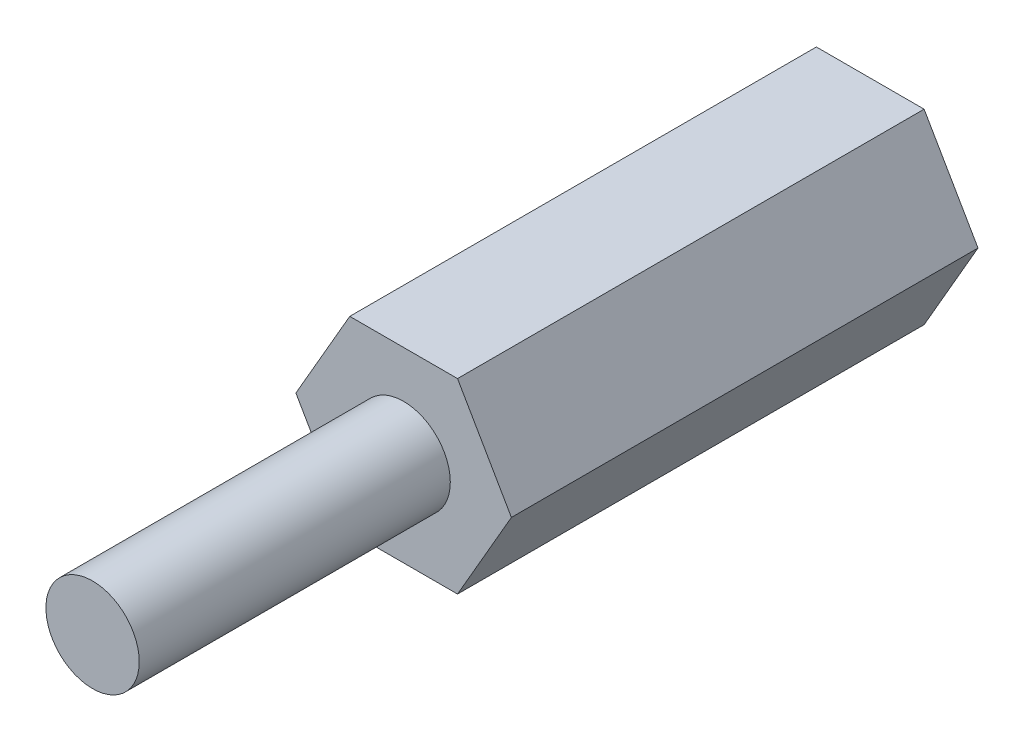
ISO-10303-21;
HEADER;
FILE_DESCRIPTION(('STEP AP214'),'2;1');
FILE_NAME('part.step','',(''),(''),'','','');
FILE_SCHEMA(('AUTOMOTIVE_DESIGN { 1 0 10303 214 1 1 1 1 }'));
ENDSEC;
DATA;
#1=APPLICATION_CONTEXT('core data for automotive mechanical design processes');
#2=APPLICATION_PROTOCOL_DEFINITION('international standard','automotive_design',2000,#1);
#3=PRODUCT_CONTEXT('',#1,'mechanical');
#4=PRODUCT('Part','Part','',(#3));
#5=PRODUCT_RELATED_PRODUCT_CATEGORY('part','',(#4));
#6=PRODUCT_DEFINITION_FORMATION('','',#4);
#7=PRODUCT_DEFINITION_CONTEXT('part definition',#1,'design');
#8=PRODUCT_DEFINITION('design','',#6,#7);
#9=PRODUCT_DEFINITION_SHAPE('','',#8);
#10=(LENGTH_UNIT() NAMED_UNIT(*) SI_UNIT(.MILLI.,.METRE.));
#11=(NAMED_UNIT(*) PLANE_ANGLE_UNIT() SI_UNIT($,.RADIAN.));
#12=(NAMED_UNIT(*) SI_UNIT($,.STERADIAN.) SOLID_ANGLE_UNIT());
#13=UNCERTAINTY_MEASURE_WITH_UNIT(LENGTH_MEASURE(1.E-05),#10,'distance_accuracy_value','');
#14=(GEOMETRIC_REPRESENTATION_CONTEXT(3) GLOBAL_UNCERTAINTY_ASSIGNED_CONTEXT((#13)) GLOBAL_UNIT_ASSIGNED_CONTEXT((#10,
#11,#12)) REPRESENTATION_CONTEXT('',''));
#15=CARTESIAN_POINT('',(0.,0.,0.));
#16=DIRECTION('',(0.,0.,1.));
#17=DIRECTION('',(1.,0.,0.));
#18=AXIS2_PLACEMENT_3D('',#15,#16,#17);
#19=CARTESIAN_POINT('',(0.,635.832012286218,-333.357743681072));
#20=DIRECTION('',(0.,0.,1.));
#21=DIRECTION('',(1.,0.,0.));
#22=AXIS2_PLACEMENT_3D('',#19,#20,#21);
#23=PLANE('',#22);
#24=CARTESIAN_POINT('',(0.,635.832012286218,-333.357743681072));
#25=DIRECTION('',(0.,0.,1.));
#26=DIRECTION('',(1.,0.,0.));
#27=AXIS2_PLACEMENT_3D('',#24,#25,#26);
#28=CIRCLE('',#27,1.5);
#29=CARTESIAN_POINT('',(1.5,635.832012286218,-333.357743681072));
#30=VERTEX_POINT('',#29);
#31=EDGE_CURVE('E20',#30,#30,#28,.F.);
#32=ORIENTED_EDGE('',*,*,#31,.F.);
#33=EDGE_LOOP('',(#32));
#34=FACE_BOUND('',#33,.T.);
#35=ADVANCED_FACE('F17',(#34),#23,.T.);
#36=CARTESIAN_POINT('',(0.,635.832012286218,-348.357743681072));
#37=DIRECTION('',(0.,0.,1.));
#38=DIRECTION('',(1.,0.,0.));
#39=AXIS2_PLACEMENT_3D('',#36,#37,#38);
#40=PLANE('',#39);
#41=CARTESIAN_POINT('',(0.,635.832012286218,-348.357743681072));
#42=DIRECTION('',(0.,0.,1.));
#43=DIRECTION('',(1.,0.,0.));
#44=AXIS2_PLACEMENT_3D('',#41,#42,#43);
#45=CIRCLE('',#44,1.25);
#46=CARTESIAN_POINT('',(1.25,635.832012286218,-348.357743681072));
#47=VERTEX_POINT('',#46);
#48=EDGE_CURVE('E80',#47,#47,#45,.F.);
#49=ORIENTED_EDGE('',*,*,#48,.T.);
#50=EDGE_LOOP('',(#49));
#51=FACE_BOUND('',#50,.T.);
#52=ADVANCED_FACE('F105',(#51),#40,.F.);
#53=CARTESIAN_POINT('',(0.,635.832012286218,-338.357743681072));
#54=DIRECTION('',(0.,0.,1.));
#55=DIRECTION('',(1.,0.,0.));
#56=AXIS2_PLACEMENT_3D('',#53,#54,#55);
#57=CYLINDRICAL_SURFACE('',#56,1.5);
#58=CARTESIAN_POINT('',(0.,635.832012286218,-343.357743681072));
#59=DIRECTION('',(0.,0.,1.));
#60=DIRECTION('',(1.,0.,0.));
#61=AXIS2_PLACEMENT_3D('',#58,#59,#60);
#62=CIRCLE('',#61,1.5);
#63=CARTESIAN_POINT('',(1.5,635.832012286218,-343.357743681072));
#64=VERTEX_POINT('',#63);
#65=EDGE_CURVE('E99',#64,#64,#62,.F.);
#66=ORIENTED_EDGE('',*,*,#65,.F.);
#67=EDGE_LOOP('',(#66));
#68=FACE_BOUND('',#67,.T.);
#69=ORIENTED_EDGE('',*,*,#31,.T.);
#70=EDGE_LOOP('',(#69));
#71=FACE_BOUND('',#70,.T.);
#72=ADVANCED_FACE('F168',(#68,#71),#57,.T.);
#73=CARTESIAN_POINT('',(1.73205080756861,638.832012286218,-358.357743681072));
#74=DIRECTION('',(0.866025403784443,0.499999999999992,0.));
#75=DIRECTION('',(-0.499999999999992,0.866025403784443,0.));
#76=AXIS2_PLACEMENT_3D('',#73,#74,#75);
#77=PLANE('',#76);
#78=DIRECTION('',(-0.500000000000041,0.866025403784415,0.));
#79=VECTOR('',#78,1.);
#80=CARTESIAN_POINT('',(3.46410161513768,635.832012286218,-358.357743681072));
#81=LINE('',#80,#79);
#82=CARTESIAN_POINT('',(3.4641016151376,635.832012286218,-358.357743681072));
#83=VERTEX_POINT('',#82);
#84=CARTESIAN_POINT('',(1.73205080756861,638.832012286218,-358.357743681072));
#85=VERTEX_POINT('',#84);
#86=EDGE_CURVE('E154',#83,#85,#81,.T.);
#87=ORIENTED_EDGE('',*,*,#86,.T.);
#88=DIRECTION('',(0.,0.,1.));
#89=VECTOR('',#88,1.);
#90=CARTESIAN_POINT('',(1.73205080756861,638.832012286218,-358.357743681072));
#91=LINE('',#90,#89);
#92=CARTESIAN_POINT('',(1.73205080756861,638.832012286218,-343.357743681072));
#93=VERTEX_POINT('',#92);
#94=EDGE_CURVE('E67',#93,#85,#91,.F.);
#95=ORIENTED_EDGE('',*,*,#94,.F.);
#96=DIRECTION('',(-0.500000000000041,0.866025403784415,0.));
#97=VECTOR('',#96,1.);
#98=CARTESIAN_POINT('',(3.46410161513768,635.832012286218,-343.357743681072));
#99=LINE('',#98,#97);
#100=CARTESIAN_POINT('',(3.46410161513764,635.832012286218,-343.357743681072));
#101=VERTEX_POINT('',#100);
#102=EDGE_CURVE('E83',#101,#93,#99,.T.);
#103=ORIENTED_EDGE('',*,*,#102,.F.);
#104=DIRECTION('',(0.,0.,1.));
#105=VECTOR('',#104,1.);
#106=CARTESIAN_POINT('',(3.46410161513768,635.832012286218,-358.357743681072));
#107=LINE('',#106,#105);
#108=EDGE_CURVE('E72',#83,#101,#107,.T.);
#109=ORIENTED_EDGE('',*,*,#108,.F.);
#110=EDGE_LOOP('',(#87,#95,#103,#109));
#111=FACE_BOUND('',#110,.T.);
#112=ADVANCED_FACE('F84',(#111),#77,.T.);
#113=CARTESIAN_POINT('',(-1.73205080756861,638.832012286218,-358.357743681072));
#114=DIRECTION('',(0.,1.,0.));
#115=DIRECTION('',(0.,0.,1.));
#116=AXIS2_PLACEMENT_3D('',#113,#114,#115);
#117=PLANE('',#116);
#118=DIRECTION('',(1.,0.,0.));
#119=VECTOR('',#118,1.);
#120=CARTESIAN_POINT('',(0.,638.832012286218,-358.357743681072));
#121=LINE('',#120,#119);
#122=CARTESIAN_POINT('',(-1.73205080756865,638.832012286218,-358.357743681072));
#123=VERTEX_POINT('',#122);
#124=EDGE_CURVE('E152',#85,#123,#121,.F.);
#125=ORIENTED_EDGE('',*,*,#124,.T.);
#126=DIRECTION('',(0.,0.,1.));
#127=VECTOR('',#126,1.);
#128=CARTESIAN_POINT('',(-1.73205080756878,638.832012286218,-358.357743681072));
#129=LINE('',#128,#127);
#130=CARTESIAN_POINT('',(-1.73205080756865,638.832012286218,-343.357743681072));
#131=VERTEX_POINT('',#130);
#132=EDGE_CURVE('E156',#131,#123,#129,.F.);
#133=ORIENTED_EDGE('',*,*,#132,.F.);
#134=DIRECTION('',(1.,0.,0.));
#135=VECTOR('',#134,1.);
#136=CARTESIAN_POINT('',(0.,638.832012286218,-343.357743681072));
#137=LINE('',#136,#135);
#138=EDGE_CURVE('E86',#93,#131,#137,.F.);
#139=ORIENTED_EDGE('',*,*,#138,.F.);
#140=ORIENTED_EDGE('',*,*,#94,.T.);
#141=EDGE_LOOP('',(#125,#133,#139,#140));
#142=FACE_BOUND('',#141,.T.);
#143=ADVANCED_FACE('F110',(#142),#117,.T.);
#144=CARTESIAN_POINT('',(0.,635.832012286218,-353.357743681072));
#145=DIRECTION('',(0.,0.,1.));
#146=DIRECTION('',(1.,0.,0.));
#147=AXIS2_PLACEMENT_3D('',#144,#145,#146);
#148=CYLINDRICAL_SURFACE('',#147,1.25);
#149=ORIENTED_EDGE('',*,*,#48,.F.);
#150=EDGE_LOOP('',(#149));
#151=FACE_BOUND('',#150,.T.);
#152=CARTESIAN_POINT('',(0.,635.832012286218,-358.357743681072));
#153=DIRECTION('',(0.,0.,1.));
#154=DIRECTION('',(1.,0.,0.));
#155=AXIS2_PLACEMENT_3D('',#152,#153,#154);
#156=CIRCLE('',#155,1.25);
#157=CARTESIAN_POINT('',(1.25,635.832012286218,-358.357743681072));
#158=VERTEX_POINT('',#157);
#159=EDGE_CURVE('E96',#158,#158,#156,.F.);
#160=ORIENTED_EDGE('',*,*,#159,.T.);
#161=EDGE_LOOP('',(#160));
#162=FACE_BOUND('',#161,.T.);
#163=ADVANCED_FACE('F107',(#151,#162),#148,.F.);
#164=CARTESIAN_POINT('',(3.46410161513768,635.832012286218,-358.357743681072));
#165=DIRECTION('',(0.866025403784443,-0.499999999999992,0.));
#166=DIRECTION('',(0.499999999999992,0.866025403784443,0.));
#167=AXIS2_PLACEMENT_3D('',#164,#165,#166);
#168=PLANE('',#167);
#169=DIRECTION('',(0.500000000000041,0.866025403784415,0.));
#170=VECTOR('',#169,1.);
#171=CARTESIAN_POINT('',(1.73205080756861,632.832012286218,-358.357743681072));
#172=LINE('',#171,#170);
#173=CARTESIAN_POINT('',(1.73205080756865,632.832012286218,-358.357743681072));
#174=VERTEX_POINT('',#173);
#175=EDGE_CURVE('E78',#174,#83,#172,.T.);
#176=ORIENTED_EDGE('',*,*,#175,.T.);
#177=ORIENTED_EDGE('',*,*,#108,.T.);
#178=DIRECTION('',(0.500000000000041,0.866025403784415,0.));
#179=VECTOR('',#178,1.);
#180=CARTESIAN_POINT('',(1.73205080756861,632.832012286218,-343.357743681072));
#181=LINE('',#180,#179);
#182=CARTESIAN_POINT('',(1.73205080756865,632.832012286218,-343.357743681072));
#183=VERTEX_POINT('',#182);
#184=EDGE_CURVE('E76',#183,#101,#181,.T.);
#185=ORIENTED_EDGE('',*,*,#184,.F.);
#186=DIRECTION('',(0.,0.,-1.));
#187=VECTOR('',#186,1.);
#188=CARTESIAN_POINT('',(1.73205080756861,632.832012286218,-358.357743681072));
#189=LINE('',#188,#187);
#190=EDGE_CURVE('E145',#174,#183,#189,.F.);
#191=ORIENTED_EDGE('',*,*,#190,.F.);
#192=EDGE_LOOP('',(#176,#177,#185,#191));
#193=FACE_BOUND('',#192,.T.);
#194=ADVANCED_FACE('F73',(#193),#168,.T.);
#195=CARTESIAN_POINT('',(0.,635.832012286218,-343.357743681072));
#196=DIRECTION('',(0.,0.,1.));
#197=DIRECTION('',(1.,0.,0.));
#198=AXIS2_PLACEMENT_3D('',#195,#196,#197);
#199=PLANE('',#198);
#200=ORIENTED_EDGE('',*,*,#65,.T.);
#201=EDGE_LOOP('',(#200));
#202=FACE_BOUND('',#201,.T.);
#203=DIRECTION('',(-0.499999999999992,-0.866025403784443,0.));
#204=VECTOR('',#203,1.);
#205=CARTESIAN_POINT('',(-3.46410161513768,635.832012286218,-343.357743681072));
#206=LINE('',#205,#204);
#207=CARTESIAN_POINT('',(-3.46410161513764,635.832012286218,-343.357743681072));
#208=VERTEX_POINT('',#207);
#209=EDGE_CURVE('E101',#208,#131,#206,.F.);
#210=ORIENTED_EDGE('',*,*,#209,.F.);
#211=DIRECTION('',(0.499999999999992,-0.866025403784443,0.));
#212=VECTOR('',#211,1.);
#213=CARTESIAN_POINT('',(-1.73205080756861,632.832012286218,-343.357743681072));
#214=LINE('',#213,#212);
#215=CARTESIAN_POINT('',(-1.73205080756861,632.832012286218,-343.357743681072));
#216=VERTEX_POINT('',#215);
#217=EDGE_CURVE('E141',#216,#208,#214,.F.);
#218=ORIENTED_EDGE('',*,*,#217,.F.);
#219=DIRECTION('',(1.,0.,0.));
#220=VECTOR('',#219,1.);
#221=CARTESIAN_POINT('',(1.73205080756861,632.832012286218,-343.357743681072));
#222=LINE('',#221,#220);
#223=EDGE_CURVE('E90',#183,#216,#222,.F.);
#224=ORIENTED_EDGE('',*,*,#223,.F.);
#225=ORIENTED_EDGE('',*,*,#184,.T.);
#226=ORIENTED_EDGE('',*,*,#102,.T.);
#227=ORIENTED_EDGE('',*,*,#138,.T.);
#228=EDGE_LOOP('',(#210,#218,#224,#225,#226,#227));
#229=FACE_BOUND('',#228,.T.);
#230=ADVANCED_FACE('F88',(#202,#229),#199,.T.);
#231=CARTESIAN_POINT('',(-3.46410161513768,635.832012286218,-358.357743681072));
#232=DIRECTION('',(-0.866025403784443,0.499999999999992,0.));
#233=DIRECTION('',(-0.499999999999992,-0.866025403784443,0.));
#234=AXIS2_PLACEMENT_3D('',#231,#232,#233);
#235=PLANE('',#234);
#236=DIRECTION('',(-0.500000000000041,-0.866025403784415,0.));
#237=VECTOR('',#236,1.);
#238=CARTESIAN_POINT('',(-1.73205080756861,638.832012286218,-358.357743681072));
#239=LINE('',#238,#237);
#240=CARTESIAN_POINT('',(-3.46410161513764,635.832012286218,-358.357743681072));
#241=VERTEX_POINT('',#240);
#242=EDGE_CURVE('E150',#123,#241,#239,.T.);
#243=ORIENTED_EDGE('',*,*,#242,.T.);
#244=DIRECTION('',(0.,0.,1.));
#245=VECTOR('',#244,1.);
#246=CARTESIAN_POINT('',(-3.46410161513751,635.832012286218,-358.357743681072));
#247=LINE('',#246,#245);
#248=EDGE_CURVE('E138',#208,#241,#247,.F.);
#249=ORIENTED_EDGE('',*,*,#248,.F.);
#250=ORIENTED_EDGE('',*,*,#209,.T.);
#251=ORIENTED_EDGE('',*,*,#132,.T.);
#252=EDGE_LOOP('',(#243,#249,#250,#251));
#253=FACE_BOUND('',#252,.T.);
#254=ADVANCED_FACE('F117',(#253),#235,.T.);
#255=CARTESIAN_POINT('',(0.,635.832012286218,-358.357743681072));
#256=DIRECTION('',(0.,0.,1.));
#257=DIRECTION('',(1.,0.,0.));
#258=AXIS2_PLACEMENT_3D('',#255,#256,#257);
#259=PLANE('',#258);
#260=ORIENTED_EDGE('',*,*,#159,.F.);
#261=EDGE_LOOP('',(#260));
#262=FACE_BOUND('',#261,.T.);
#263=DIRECTION('',(1.,0.,0.));
#264=VECTOR('',#263,1.);
#265=CARTESIAN_POINT('',(1.73205080756861,632.832012286218,-358.357743681072));
#266=LINE('',#265,#264);
#267=CARTESIAN_POINT('',(-1.73205080756861,632.832012286218,-358.357743681072));
#268=VERTEX_POINT('',#267);
#269=EDGE_CURVE('E35',#268,#174,#266,.T.);
#270=ORIENTED_EDGE('',*,*,#269,.F.);
#271=DIRECTION('',(0.499999999999992,-0.866025403784443,0.));
#272=VECTOR('',#271,1.);
#273=CARTESIAN_POINT('',(-1.73205080756861,632.832012286218,-358.357743681072));
#274=LINE('',#273,#272);
#275=EDGE_CURVE('E26',#241,#268,#274,.T.);
#276=ORIENTED_EDGE('',*,*,#275,.F.);
#277=ORIENTED_EDGE('',*,*,#242,.F.);
#278=ORIENTED_EDGE('',*,*,#124,.F.);
#279=ORIENTED_EDGE('',*,*,#86,.F.);
#280=ORIENTED_EDGE('',*,*,#175,.F.);
#281=EDGE_LOOP('',(#270,#276,#277,#278,#279,#280));
#282=FACE_BOUND('',#281,.T.);
#283=ADVANCED_FACE('F114',(#262,#282),#259,.F.);
#284=CARTESIAN_POINT('',(1.73205080756861,632.832012286218,-358.357743681072));
#285=DIRECTION('',(0.,-1.,0.));
#286=DIRECTION('',(0.,0.,-1.));
#287=AXIS2_PLACEMENT_3D('',#284,#285,#286);
#288=PLANE('',#287);
#289=ORIENTED_EDGE('',*,*,#269,.T.);
#290=ORIENTED_EDGE('',*,*,#190,.T.);
#291=ORIENTED_EDGE('',*,*,#223,.T.);
#292=DIRECTION('',(0.,0.,1.));
#293=VECTOR('',#292,1.);
#294=CARTESIAN_POINT('',(-1.73205080756861,632.832012286218,-358.357743681072));
#295=LINE('',#294,#293);
#296=EDGE_CURVE('E11',#268,#216,#295,.T.);
#297=ORIENTED_EDGE('',*,*,#296,.F.);
#298=EDGE_LOOP('',(#289,#290,#291,#297));
#299=FACE_BOUND('',#298,.T.);
#300=ADVANCED_FACE('F116',(#299),#288,.T.);
#301=CARTESIAN_POINT('',(-1.73205080756861,632.832012286218,-358.357743681072));
#302=DIRECTION('',(-0.866025403784443,-0.499999999999992,0.));
#303=DIRECTION('',(0.499999999999992,-0.866025403784443,0.));
#304=AXIS2_PLACEMENT_3D('',#301,#302,#303);
#305=PLANE('',#304);
#306=ORIENTED_EDGE('',*,*,#275,.T.);
#307=ORIENTED_EDGE('',*,*,#296,.T.);
#308=ORIENTED_EDGE('',*,*,#217,.T.);
#309=ORIENTED_EDGE('',*,*,#248,.T.);
#310=EDGE_LOOP('',(#306,#307,#308,#309));
#311=FACE_BOUND('',#310,.T.);
#312=ADVANCED_FACE('F124',(#311),#305,.T.);
#313=CLOSED_SHELL('',(#35,#52,#72,#112,#143,#163,#194,#230,#254,#283,#300,#312));
#314=MANIFOLD_SOLID_BREP('B1',#313);
#315=ADVANCED_BREP_SHAPE_REPRESENTATION('',(#18,#314),#14);
#316=SHAPE_DEFINITION_REPRESENTATION(#9,#315);
ENDSEC;
END-ISO-10303-21;
